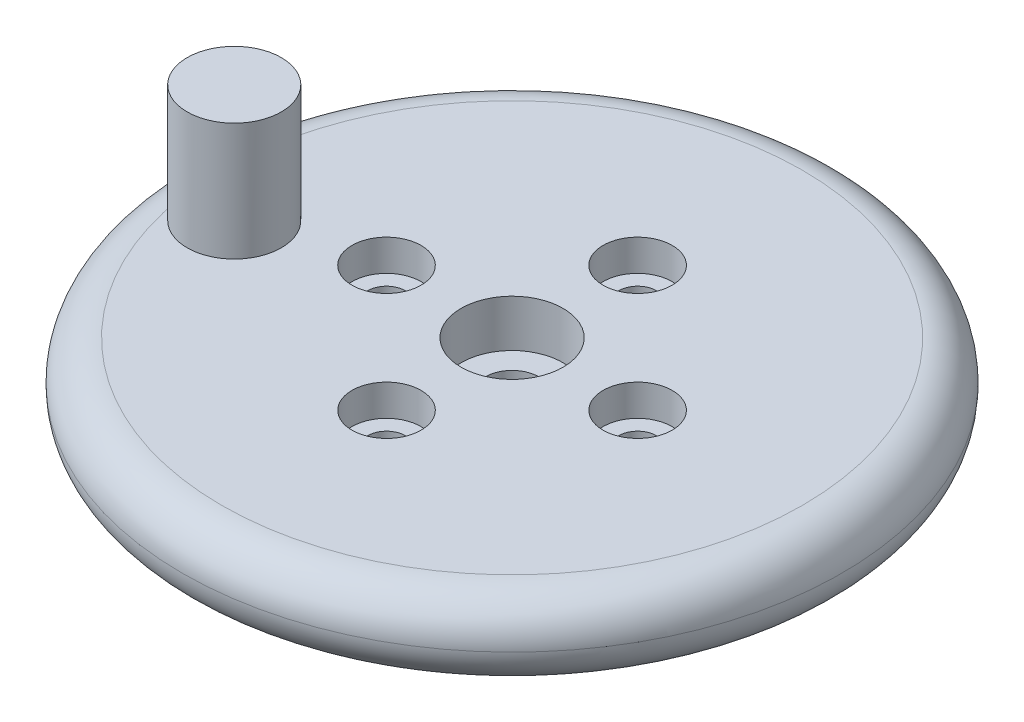
ISO-10303-21;
HEADER;
FILE_DESCRIPTION(('STEP AP214'),'2;1');
FILE_NAME('part.step','',(''),(''),'','','');
FILE_SCHEMA(('AUTOMOTIVE_DESIGN { 1 0 10303 214 1 1 1 1 }'));
ENDSEC;
DATA;
#1=APPLICATION_CONTEXT('core data for automotive mechanical design processes');
#2=APPLICATION_PROTOCOL_DEFINITION('international standard','automotive_design',2000,#1);
#3=PRODUCT_CONTEXT('',#1,'mechanical');
#4=PRODUCT('Part','Part','',(#3));
#5=PRODUCT_RELATED_PRODUCT_CATEGORY('part','',(#4));
#6=PRODUCT_DEFINITION_FORMATION('','',#4);
#7=PRODUCT_DEFINITION_CONTEXT('part definition',#1,'design');
#8=PRODUCT_DEFINITION('design','',#6,#7);
#9=PRODUCT_DEFINITION_SHAPE('','',#8);
#10=(LENGTH_UNIT() NAMED_UNIT(*) SI_UNIT(.MILLI.,.METRE.));
#11=(NAMED_UNIT(*) PLANE_ANGLE_UNIT() SI_UNIT($,.RADIAN.));
#12=(NAMED_UNIT(*) SI_UNIT($,.STERADIAN.) SOLID_ANGLE_UNIT());
#13=UNCERTAINTY_MEASURE_WITH_UNIT(LENGTH_MEASURE(1.E-05),#10,'distance_accuracy_value','');
#14=(GEOMETRIC_REPRESENTATION_CONTEXT(3) GLOBAL_UNCERTAINTY_ASSIGNED_CONTEXT((#13)) GLOBAL_UNIT_ASSIGNED_CONTEXT((#10,
#11,#12)) REPRESENTATION_CONTEXT('',''));
#15=CARTESIAN_POINT('',(0.,0.,0.));
#16=DIRECTION('',(0.,0.,1.));
#17=DIRECTION('',(1.,0.,0.));
#18=AXIS2_PLACEMENT_3D('',#15,#16,#17);
#19=CARTESIAN_POINT('',(0.,5.,0.));
#20=DIRECTION('',(0.,1.,0.));
#21=DIRECTION('',(0.,0.,1.));
#22=AXIS2_PLACEMENT_3D('',#19,#20,#21);
#23=PLANE('',#22);
#24=CARTESIAN_POINT('',(0.,5.,8.));
#25=DIRECTION('',(0.,1.,0.));
#26=DIRECTION('',(-1.,0.,0.));
#27=AXIS2_PLACEMENT_3D('',#24,#25,#26);
#28=CIRCLE('',#27,2.2);
#29=CARTESIAN_POINT('',(-2.19999999999992,5.,8.00000000000002));
#30=VERTEX_POINT('',#29);
#31=EDGE_CURVE('E170',#30,#30,#28,.T.);
#32=ORIENTED_EDGE('',*,*,#31,.F.);
#33=EDGE_LOOP('',(#32));
#34=FACE_BOUND('',#33,.T.);
#35=CARTESIAN_POINT('',(-8.,5.,0.));
#36=DIRECTION('',(0.,1.,0.));
#37=DIRECTION('',(0.,0.,-1.));
#38=AXIS2_PLACEMENT_3D('',#35,#36,#37);
#39=CIRCLE('',#38,2.2);
#40=CARTESIAN_POINT('',(-8.,5.,-2.2));
#41=VERTEX_POINT('',#40);
#42=EDGE_CURVE('E183',#41,#41,#39,.T.);
#43=ORIENTED_EDGE('',*,*,#42,.F.);
#44=EDGE_LOOP('',(#43));
#45=FACE_BOUND('',#44,.T.);
#46=CARTESIAN_POINT('',(0.,5.,-8.));
#47=DIRECTION('',(0.,1.,0.));
#48=DIRECTION('',(1.,0.,0.));
#49=AXIS2_PLACEMENT_3D('',#46,#47,#48);
#50=CIRCLE('',#49,2.2);
#51=CARTESIAN_POINT('',(2.19999999999997,5.,-8.00000000000001));
#52=VERTEX_POINT('',#51);
#53=EDGE_CURVE('E195',#52,#52,#50,.T.);
#54=ORIENTED_EDGE('',*,*,#53,.F.);
#55=EDGE_LOOP('',(#54));
#56=FACE_BOUND('',#55,.T.);
#57=CARTESIAN_POINT('',(8.,5.,0.));
#58=DIRECTION('',(0.,1.,0.));
#59=DIRECTION('',(0.,0.,1.));
#60=AXIS2_PLACEMENT_3D('',#57,#58,#59);
#61=CIRCLE('',#60,2.2);
#62=CARTESIAN_POINT('',(8.,5.,2.2));
#63=VERTEX_POINT('',#62);
#64=EDGE_CURVE('E207',#63,#63,#61,.T.);
#65=ORIENTED_EDGE('',*,*,#64,.F.);
#66=EDGE_LOOP('',(#65));
#67=FACE_BOUND('',#66,.T.);
#68=CARTESIAN_POINT('',(0.,5.,0.));
#69=DIRECTION('',(0.,1.,0.));
#70=DIRECTION('',(0.,0.,1.));
#71=AXIS2_PLACEMENT_3D('',#68,#69,#70);
#72=CIRCLE('',#71,3.25);
#73=CARTESIAN_POINT('',(0.,5.,3.25));
#74=VERTEX_POINT('',#73);
#75=EDGE_CURVE('E219',#74,#74,#72,.T.);
#76=ORIENTED_EDGE('',*,*,#75,.F.);
#77=EDGE_LOOP('',(#76));
#78=FACE_BOUND('',#77,.T.);
#79=CARTESIAN_POINT('',(0.,5.,0.));
#80=DIRECTION('',(0.,1.,0.));
#81=DIRECTION('',(0.,0.,1.));
#82=AXIS2_PLACEMENT_3D('',#79,#80,#81);
#83=CIRCLE('',#82,18.5);
#84=CARTESIAN_POINT('',(-18.2791507469028,5.,2.85002595988233));
#85=VERTEX_POINT('',#84);
#86=EDGE_CURVE('E13',#85,#85,#83,.T.);
#87=ORIENTED_EDGE('',*,*,#86,.T.);
#88=CARTESIAN_POINT('',(-15.3149641392969,5.,2.38785958800952));
#89=DIRECTION('',(0.,1.,0.));
#90=DIRECTION('',(0.,0.,1.));
#91=AXIS2_PLACEMENT_3D('',#88,#89,#90);
#92=CIRCLE('',#91,3.);
#93=EDGE_CURVE('E61',#85,#85,#92,.T.);
#94=ORIENTED_EDGE('',*,*,#93,.F.);
#95=EDGE_LOOP('',(#87,#94));
#96=FACE_BOUND('',#95,.T.);
#97=ADVANCED_FACE('F49',(#34,#45,#56,#67,#78,#96),#23,.T.);
#98=CARTESIAN_POINT('',(0.,0.,0.));
#99=DIRECTION('',(0.,1.,0.));
#100=DIRECTION('',(0.,0.,1.));
#101=AXIS2_PLACEMENT_3D('',#98,#99,#100);
#102=PLANE('',#101);
#103=CARTESIAN_POINT('',(0.,0.,8.));
#104=DIRECTION('',(0.,1.,0.));
#105=DIRECTION('',(-1.,0.,0.));
#106=AXIS2_PLACEMENT_3D('',#103,#104,#105);
#107=CIRCLE('',#106,1.2);
#108=CARTESIAN_POINT('',(-1.19999999999992,0.,8.00000000000001));
#109=VERTEX_POINT('',#108);
#110=EDGE_CURVE('E177',#109,#109,#107,.T.);
#111=ORIENTED_EDGE('',*,*,#110,.T.);
#112=EDGE_LOOP('',(#111));
#113=FACE_BOUND('',#112,.T.);
#114=CARTESIAN_POINT('',(-8.,0.,0.));
#115=DIRECTION('',(0.,1.,0.));
#116=DIRECTION('',(0.,0.,-1.));
#117=AXIS2_PLACEMENT_3D('',#114,#115,#116);
#118=CIRCLE('',#117,1.2);
#119=CARTESIAN_POINT('',(-8.,0.,-1.2));
#120=VERTEX_POINT('',#119);
#121=EDGE_CURVE('E192',#120,#120,#118,.T.);
#122=ORIENTED_EDGE('',*,*,#121,.T.);
#123=EDGE_LOOP('',(#122));
#124=FACE_BOUND('',#123,.T.);
#125=CARTESIAN_POINT('',(0.,0.,-8.));
#126=DIRECTION('',(0.,1.,0.));
#127=DIRECTION('',(1.,0.,0.));
#128=AXIS2_PLACEMENT_3D('',#125,#126,#127);
#129=CIRCLE('',#128,1.2);
#130=CARTESIAN_POINT('',(1.19999999999997,0.,-8.));
#131=VERTEX_POINT('',#130);
#132=EDGE_CURVE('E204',#131,#131,#129,.T.);
#133=ORIENTED_EDGE('',*,*,#132,.T.);
#134=EDGE_LOOP('',(#133));
#135=FACE_BOUND('',#134,.T.);
#136=CARTESIAN_POINT('',(8.,0.,0.));
#137=DIRECTION('',(0.,1.,0.));
#138=DIRECTION('',(0.,0.,1.));
#139=AXIS2_PLACEMENT_3D('',#136,#137,#138);
#140=CIRCLE('',#139,1.2);
#141=CARTESIAN_POINT('',(8.,0.,1.2));
#142=VERTEX_POINT('',#141);
#143=EDGE_CURVE('E216',#142,#142,#140,.T.);
#144=ORIENTED_EDGE('',*,*,#143,.T.);
#145=EDGE_LOOP('',(#144));
#146=FACE_BOUND('',#145,.T.);
#147=CARTESIAN_POINT('',(0.,0.,0.));
#148=DIRECTION('',(0.,1.,0.));
#149=DIRECTION('',(0.,0.,1.));
#150=AXIS2_PLACEMENT_3D('',#147,#148,#149);
#151=CIRCLE('',#150,1.7);
#152=CARTESIAN_POINT('',(0.,0.,1.7));
#153=VERTEX_POINT('',#152);
#154=EDGE_CURVE('E65',#153,#153,#151,.T.);
#155=ORIENTED_EDGE('',*,*,#154,.T.);
#156=EDGE_LOOP('',(#155));
#157=FACE_BOUND('',#156,.T.);
#158=CARTESIAN_POINT('',(0.,0.,0.));
#159=DIRECTION('',(0.,1.,0.));
#160=DIRECTION('',(0.,0.,1.));
#161=AXIS2_PLACEMENT_3D('',#158,#159,#160);
#162=CIRCLE('',#161,18.5);
#163=CARTESIAN_POINT('',(0.,0.,18.5));
#164=VERTEX_POINT('',#163);
#165=EDGE_CURVE('E57',#164,#164,#162,.F.);
#166=ORIENTED_EDGE('',*,*,#165,.T.);
#167=EDGE_LOOP('',(#166));
#168=FACE_BOUND('',#167,.T.);
#169=ADVANCED_FACE('F82',(#113,#124,#135,#146,#157,#168),#102,.F.);
#170=CARTESIAN_POINT('',(0.,2.5,0.));
#171=DIRECTION('',(0.,1.,0.));
#172=DIRECTION('',(0.,0.,1.));
#173=AXIS2_PLACEMENT_3D('',#170,#171,#172);
#174=TOROIDAL_SURFACE('',#173,18.5,2.5);
#175=ORIENTED_EDGE('',*,*,#86,.F.);
#176=EDGE_LOOP('',(#175));
#177=FACE_BOUND('',#176,.T.);
#178=CARTESIAN_POINT('',(0.,2.5,0.));
#179=DIRECTION('',(0.,1.,0.));
#180=DIRECTION('',(0.,0.,1.));
#181=AXIS2_PLACEMENT_3D('',#178,#179,#180);
#182=CIRCLE('',#181,21.);
#183=CARTESIAN_POINT('',(0.,2.5,21.));
#184=VERTEX_POINT('',#183);
#185=EDGE_CURVE('E53',#184,#184,#182,.F.);
#186=ORIENTED_EDGE('',*,*,#185,.F.);
#187=EDGE_LOOP('',(#186));
#188=FACE_BOUND('',#187,.T.);
#189=ADVANCED_FACE('F51',(#177,#188),#174,.T.);
#190=CARTESIAN_POINT('',(0.,2.5,0.));
#191=DIRECTION('',(0.,1.,0.));
#192=DIRECTION('',(0.,0.,1.));
#193=AXIS2_PLACEMENT_3D('',#190,#191,#192);
#194=TOROIDAL_SURFACE('',#193,18.5,2.5);
#195=ORIENTED_EDGE('',*,*,#165,.F.);
#196=EDGE_LOOP('',(#195));
#197=FACE_BOUND('',#196,.T.);
#198=ORIENTED_EDGE('',*,*,#185,.T.);
#199=EDGE_LOOP('',(#198));
#200=FACE_BOUND('',#199,.T.);
#201=ADVANCED_FACE('F79',(#197,#200),#194,.T.);
#202=CARTESIAN_POINT('',(-15.3149641392969,12.5,2.38785958800952));
#203=DIRECTION('',(0.,-1.,0.));
#204=DIRECTION('',(0.,0.,-1.));
#205=AXIS2_PLACEMENT_3D('',#202,#203,#204);
#206=CYLINDRICAL_SURFACE('',#205,3.);
#207=CARTESIAN_POINT('',(-15.3149641392969,12.5,2.38785958800952));
#208=DIRECTION('',(0.,1.,0.));
#209=DIRECTION('',(0.,0.,1.));
#210=AXIS2_PLACEMENT_3D('',#207,#208,#209);
#211=CIRCLE('',#210,3.);
#212=CARTESIAN_POINT('',(-15.3149641392969,12.5,5.38785958800952));
#213=VERTEX_POINT('',#212);
#214=EDGE_CURVE('E64',#213,#213,#211,.T.);
#215=ORIENTED_EDGE('',*,*,#214,.F.);
#216=EDGE_LOOP('',(#215));
#217=FACE_BOUND('',#216,.T.);
#218=ORIENTED_EDGE('',*,*,#93,.T.);
#219=EDGE_LOOP('',(#218));
#220=FACE_BOUND('',#219,.T.);
#221=ADVANCED_FACE('F62',(#217,#220),#206,.T.);
#222=CARTESIAN_POINT('',(-15.3149641392969,12.5,2.38785958800952));
#223=DIRECTION('',(0.,1.,0.));
#224=DIRECTION('',(0.,0.,1.));
#225=AXIS2_PLACEMENT_3D('',#222,#223,#224);
#226=PLANE('',#225);
#227=ORIENTED_EDGE('',*,*,#214,.T.);
#228=EDGE_LOOP('',(#227));
#229=FACE_BOUND('',#228,.T.);
#230=ADVANCED_FACE('F102',(#229),#226,.T.);
#231=CARTESIAN_POINT('',(0.,5.,0.));
#232=DIRECTION('',(0.,1.,0.));
#233=DIRECTION('',(0.,0.,1.));
#234=AXIS2_PLACEMENT_3D('',#231,#232,#233);
#235=CYLINDRICAL_SURFACE('',#234,1.7);
#236=ORIENTED_EDGE('',*,*,#154,.F.);
#237=EDGE_LOOP('',(#236));
#238=FACE_BOUND('',#237,.T.);
#239=CARTESIAN_POINT('',(0.,2.,0.));
#240=DIRECTION('',(0.,1.,0.));
#241=DIRECTION('',(0.,0.,1.));
#242=AXIS2_PLACEMENT_3D('',#239,#240,#241);
#243=CIRCLE('',#242,1.7);
#244=CARTESIAN_POINT('',(0.,2.,1.7));
#245=VERTEX_POINT('',#244);
#246=EDGE_CURVE('E70',#245,#245,#243,.T.);
#247=ORIENTED_EDGE('',*,*,#246,.T.);
#248=EDGE_LOOP('',(#247));
#249=FACE_BOUND('',#248,.T.);
#250=ADVANCED_FACE('F106',(#238,#249),#235,.F.);
#251=CARTESIAN_POINT('',(1.7,2.,0.));
#252=DIRECTION('',(0.,-1.,0.));
#253=DIRECTION('',(0.,0.,-1.));
#254=AXIS2_PLACEMENT_3D('',#251,#252,#253);
#255=PLANE('',#254);
#256=ORIENTED_EDGE('',*,*,#246,.F.);
#257=EDGE_LOOP('',(#256));
#258=FACE_BOUND('',#257,.T.);
#259=CARTESIAN_POINT('',(0.,2.,0.));
#260=DIRECTION('',(0.,1.,0.));
#261=DIRECTION('',(0.,0.,1.));
#262=AXIS2_PLACEMENT_3D('',#259,#260,#261);
#263=CIRCLE('',#262,3.25);
#264=CARTESIAN_POINT('',(0.,2.,3.25));
#265=VERTEX_POINT('',#264);
#266=EDGE_CURVE('E222',#265,#265,#263,.T.);
#267=ORIENTED_EDGE('',*,*,#266,.T.);
#268=EDGE_LOOP('',(#267));
#269=FACE_BOUND('',#268,.T.);
#270=ADVANCED_FACE('F110',(#258,#269),#255,.F.);
#271=CARTESIAN_POINT('',(0.,5.,0.));
#272=DIRECTION('',(0.,1.,0.));
#273=DIRECTION('',(0.,0.,1.));
#274=AXIS2_PLACEMENT_3D('',#271,#272,#273);
#275=CYLINDRICAL_SURFACE('',#274,3.25);
#276=ORIENTED_EDGE('',*,*,#266,.F.);
#277=EDGE_LOOP('',(#276));
#278=FACE_BOUND('',#277,.T.);
#279=ORIENTED_EDGE('',*,*,#75,.T.);
#280=EDGE_LOOP('',(#279));
#281=FACE_BOUND('',#280,.T.);
#282=ADVANCED_FACE('F114',(#278,#281),#275,.F.);
#283=CARTESIAN_POINT('',(8.,5.,0.));
#284=DIRECTION('',(0.,1.,0.));
#285=DIRECTION('',(0.,0.,1.));
#286=AXIS2_PLACEMENT_3D('',#283,#284,#285);
#287=CYLINDRICAL_SURFACE('',#286,1.2);
#288=CARTESIAN_POINT('',(8.,3.,0.));
#289=DIRECTION('',(0.,1.,0.));
#290=DIRECTION('',(0.,0.,1.));
#291=AXIS2_PLACEMENT_3D('',#288,#289,#290);
#292=CIRCLE('',#291,1.2);
#293=CARTESIAN_POINT('',(8.,3.,1.2));
#294=VERTEX_POINT('',#293);
#295=EDGE_CURVE('E213',#294,#294,#292,.T.);
#296=ORIENTED_EDGE('',*,*,#295,.T.);
#297=EDGE_LOOP('',(#296));
#298=FACE_BOUND('',#297,.T.);
#299=ORIENTED_EDGE('',*,*,#143,.F.);
#300=EDGE_LOOP('',(#299));
#301=FACE_BOUND('',#300,.T.);
#302=ADVANCED_FACE('F118',(#298,#301),#287,.F.);
#303=CARTESIAN_POINT('',(9.2,3.,0.));
#304=DIRECTION('',(0.,1.,0.));
#305=DIRECTION('',(0.,0.,1.));
#306=AXIS2_PLACEMENT_3D('',#303,#304,#305);
#307=PLANE('',#306);
#308=CARTESIAN_POINT('',(8.,3.,0.));
#309=DIRECTION('',(0.,1.,0.));
#310=DIRECTION('',(0.,0.,1.));
#311=AXIS2_PLACEMENT_3D('',#308,#309,#310);
#312=CIRCLE('',#311,2.2);
#313=CARTESIAN_POINT('',(8.,3.,2.2));
#314=VERTEX_POINT('',#313);
#315=EDGE_CURVE('E210',#314,#314,#312,.T.);
#316=ORIENTED_EDGE('',*,*,#315,.T.);
#317=EDGE_LOOP('',(#316));
#318=FACE_BOUND('',#317,.T.);
#319=ORIENTED_EDGE('',*,*,#295,.F.);
#320=EDGE_LOOP('',(#319));
#321=FACE_BOUND('',#320,.T.);
#322=ADVANCED_FACE('F122',(#318,#321),#307,.T.);
#323=CARTESIAN_POINT('',(8.,5.,0.));
#324=DIRECTION('',(0.,1.,0.));
#325=DIRECTION('',(0.,0.,1.));
#326=AXIS2_PLACEMENT_3D('',#323,#324,#325);
#327=CYLINDRICAL_SURFACE('',#326,2.2);
#328=ORIENTED_EDGE('',*,*,#64,.T.);
#329=EDGE_LOOP('',(#328));
#330=FACE_BOUND('',#329,.T.);
#331=ORIENTED_EDGE('',*,*,#315,.F.);
#332=EDGE_LOOP('',(#331));
#333=FACE_BOUND('',#332,.T.);
#334=ADVANCED_FACE('F126',(#330,#333),#327,.F.);
#335=CARTESIAN_POINT('',(0.,5.,-8.));
#336=DIRECTION('',(0.,1.,0.));
#337=DIRECTION('',(1.,0.,0.));
#338=AXIS2_PLACEMENT_3D('',#335,#336,#337);
#339=CYLINDRICAL_SURFACE('',#338,1.2);
#340=CARTESIAN_POINT('',(0.,3.,-8.));
#341=DIRECTION('',(0.,1.,0.));
#342=DIRECTION('',(1.,0.,0.));
#343=AXIS2_PLACEMENT_3D('',#340,#341,#342);
#344=CIRCLE('',#343,1.2);
#345=CARTESIAN_POINT('',(1.19999999999997,3.,-8.));
#346=VERTEX_POINT('',#345);
#347=EDGE_CURVE('E201',#346,#346,#344,.T.);
#348=ORIENTED_EDGE('',*,*,#347,.T.);
#349=EDGE_LOOP('',(#348));
#350=FACE_BOUND('',#349,.T.);
#351=ORIENTED_EDGE('',*,*,#132,.F.);
#352=EDGE_LOOP('',(#351));
#353=FACE_BOUND('',#352,.T.);
#354=ADVANCED_FACE('F130',(#350,#353),#339,.F.);
#355=CARTESIAN_POINT('',(0.,3.,-9.2));
#356=DIRECTION('',(0.,1.,0.));
#357=DIRECTION('',(1.,0.,0.));
#358=AXIS2_PLACEMENT_3D('',#355,#356,#357);
#359=PLANE('',#358);
#360=CARTESIAN_POINT('',(0.,3.,-8.));
#361=DIRECTION('',(0.,1.,0.));
#362=DIRECTION('',(1.,0.,0.));
#363=AXIS2_PLACEMENT_3D('',#360,#361,#362);
#364=CIRCLE('',#363,2.2);
#365=CARTESIAN_POINT('',(2.19999999999997,3.,-8.00000000000001));
#366=VERTEX_POINT('',#365);
#367=EDGE_CURVE('E198',#366,#366,#364,.T.);
#368=ORIENTED_EDGE('',*,*,#367,.T.);
#369=EDGE_LOOP('',(#368));
#370=FACE_BOUND('',#369,.T.);
#371=ORIENTED_EDGE('',*,*,#347,.F.);
#372=EDGE_LOOP('',(#371));
#373=FACE_BOUND('',#372,.T.);
#374=ADVANCED_FACE('F134',(#370,#373),#359,.T.);
#375=CARTESIAN_POINT('',(0.,5.,-8.));
#376=DIRECTION('',(0.,1.,0.));
#377=DIRECTION('',(1.,0.,0.));
#378=AXIS2_PLACEMENT_3D('',#375,#376,#377);
#379=CYLINDRICAL_SURFACE('',#378,2.2);
#380=ORIENTED_EDGE('',*,*,#53,.T.);
#381=EDGE_LOOP('',(#380));
#382=FACE_BOUND('',#381,.T.);
#383=ORIENTED_EDGE('',*,*,#367,.F.);
#384=EDGE_LOOP('',(#383));
#385=FACE_BOUND('',#384,.T.);
#386=ADVANCED_FACE('F138',(#382,#385),#379,.F.);
#387=CARTESIAN_POINT('',(-8.,5.,0.));
#388=DIRECTION('',(0.,1.,0.));
#389=DIRECTION('',(0.,0.,-1.));
#390=AXIS2_PLACEMENT_3D('',#387,#388,#389);
#391=CYLINDRICAL_SURFACE('',#390,1.2);
#392=CARTESIAN_POINT('',(-8.,3.,0.));
#393=DIRECTION('',(0.,1.,0.));
#394=DIRECTION('',(0.,0.,-1.));
#395=AXIS2_PLACEMENT_3D('',#392,#393,#394);
#396=CIRCLE('',#395,1.2);
#397=CARTESIAN_POINT('',(-8.,3.,-1.2));
#398=VERTEX_POINT('',#397);
#399=EDGE_CURVE('E189',#398,#398,#396,.T.);
#400=ORIENTED_EDGE('',*,*,#399,.T.);
#401=EDGE_LOOP('',(#400));
#402=FACE_BOUND('',#401,.T.);
#403=ORIENTED_EDGE('',*,*,#121,.F.);
#404=EDGE_LOOP('',(#403));
#405=FACE_BOUND('',#404,.T.);
#406=ADVANCED_FACE('F142',(#402,#405),#391,.F.);
#407=CARTESIAN_POINT('',(-9.2,3.,0.));
#408=DIRECTION('',(0.,1.,0.));
#409=DIRECTION('',(0.,0.,-1.));
#410=AXIS2_PLACEMENT_3D('',#407,#408,#409);
#411=PLANE('',#410);
#412=CARTESIAN_POINT('',(-8.,3.,0.));
#413=DIRECTION('',(0.,1.,0.));
#414=DIRECTION('',(0.,0.,-1.));
#415=AXIS2_PLACEMENT_3D('',#412,#413,#414);
#416=CIRCLE('',#415,2.2);
#417=CARTESIAN_POINT('',(-8.,3.,-2.2));
#418=VERTEX_POINT('',#417);
#419=EDGE_CURVE('E186',#418,#418,#416,.T.);
#420=ORIENTED_EDGE('',*,*,#419,.T.);
#421=EDGE_LOOP('',(#420));
#422=FACE_BOUND('',#421,.T.);
#423=ORIENTED_EDGE('',*,*,#399,.F.);
#424=EDGE_LOOP('',(#423));
#425=FACE_BOUND('',#424,.T.);
#426=ADVANCED_FACE('F146',(#422,#425),#411,.T.);
#427=CARTESIAN_POINT('',(-8.,5.,0.));
#428=DIRECTION('',(0.,1.,0.));
#429=DIRECTION('',(0.,0.,-1.));
#430=AXIS2_PLACEMENT_3D('',#427,#428,#429);
#431=CYLINDRICAL_SURFACE('',#430,2.2);
#432=ORIENTED_EDGE('',*,*,#42,.T.);
#433=EDGE_LOOP('',(#432));
#434=FACE_BOUND('',#433,.T.);
#435=ORIENTED_EDGE('',*,*,#419,.F.);
#436=EDGE_LOOP('',(#435));
#437=FACE_BOUND('',#436,.T.);
#438=ADVANCED_FACE('F150',(#434,#437),#431,.F.);
#439=CARTESIAN_POINT('',(0.,5.,8.));
#440=DIRECTION('',(0.,1.,0.));
#441=DIRECTION('',(-1.,0.,0.));
#442=AXIS2_PLACEMENT_3D('',#439,#440,#441);
#443=CYLINDRICAL_SURFACE('',#442,1.2);
#444=CARTESIAN_POINT('',(0.,3.,8.));
#445=DIRECTION('',(0.,1.,0.));
#446=DIRECTION('',(-1.,0.,0.));
#447=AXIS2_PLACEMENT_3D('',#444,#445,#446);
#448=CIRCLE('',#447,1.2);
#449=CARTESIAN_POINT('',(-1.19999999999992,3.,8.00000000000001));
#450=VERTEX_POINT('',#449);
#451=EDGE_CURVE('E174',#450,#450,#448,.T.);
#452=ORIENTED_EDGE('',*,*,#451,.T.);
#453=EDGE_LOOP('',(#452));
#454=FACE_BOUND('',#453,.T.);
#455=ORIENTED_EDGE('',*,*,#110,.F.);
#456=EDGE_LOOP('',(#455));
#457=FACE_BOUND('',#456,.T.);
#458=ADVANCED_FACE('F154',(#454,#457),#443,.F.);
#459=CARTESIAN_POINT('',(0.,3.,9.2));
#460=DIRECTION('',(0.,1.,0.));
#461=DIRECTION('',(-1.,0.,0.));
#462=AXIS2_PLACEMENT_3D('',#459,#460,#461);
#463=PLANE('',#462);
#464=CARTESIAN_POINT('',(0.,3.,8.));
#465=DIRECTION('',(0.,1.,0.));
#466=DIRECTION('',(-1.,0.,0.));
#467=AXIS2_PLACEMENT_3D('',#464,#465,#466);
#468=CIRCLE('',#467,2.2);
#469=CARTESIAN_POINT('',(-2.19999999999992,3.,8.00000000000002));
#470=VERTEX_POINT('',#469);
#471=EDGE_CURVE('E173',#470,#470,#468,.T.);
#472=ORIENTED_EDGE('',*,*,#471,.T.);
#473=EDGE_LOOP('',(#472));
#474=FACE_BOUND('',#473,.T.);
#475=ORIENTED_EDGE('',*,*,#451,.F.);
#476=EDGE_LOOP('',(#475));
#477=FACE_BOUND('',#476,.T.);
#478=ADVANCED_FACE('F158',(#474,#477),#463,.T.);
#479=CARTESIAN_POINT('',(0.,5.,8.));
#480=DIRECTION('',(0.,1.,0.));
#481=DIRECTION('',(-1.,0.,0.));
#482=AXIS2_PLACEMENT_3D('',#479,#480,#481);
#483=CYLINDRICAL_SURFACE('',#482,2.2);
#484=ORIENTED_EDGE('',*,*,#31,.T.);
#485=EDGE_LOOP('',(#484));
#486=FACE_BOUND('',#485,.T.);
#487=ORIENTED_EDGE('',*,*,#471,.F.);
#488=EDGE_LOOP('',(#487));
#489=FACE_BOUND('',#488,.T.);
#490=ADVANCED_FACE('F162',(#486,#489),#483,.F.);
#491=CLOSED_SHELL('',(#97,#169,#189,#201,#221,#230,#250,#270,#282,#302,#322,#334,#354,#374,#386,
#406,#426,#438,#458,#478,#490));
#492=MANIFOLD_SOLID_BREP('B2',#491);
#493=ADVANCED_BREP_SHAPE_REPRESENTATION('',(#18,#492),#14);
#494=SHAPE_DEFINITION_REPRESENTATION(#9,#493);
ENDSEC;
END-ISO-10303-21;
